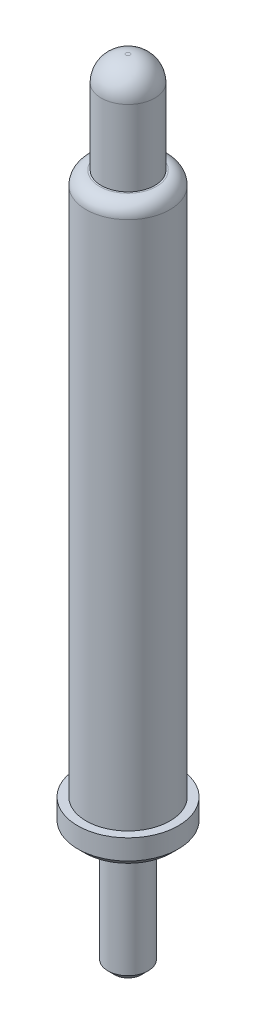
ISO-10303-21;
HEADER;
FILE_DESCRIPTION(('STEP AP214'),'2;1');
FILE_NAME('part.step','',(''),(''),'','','');
FILE_SCHEMA(('AUTOMOTIVE_DESIGN { 1 0 10303 214 1 1 1 1 }'));
ENDSEC;
DATA;
#1=APPLICATION_CONTEXT('core data for automotive mechanical design processes');
#2=APPLICATION_PROTOCOL_DEFINITION('international standard','automotive_design',2000,#1);
#3=PRODUCT_CONTEXT('',#1,'mechanical');
#4=PRODUCT('Part','Part','',(#3));
#5=PRODUCT_RELATED_PRODUCT_CATEGORY('part','',(#4));
#6=PRODUCT_DEFINITION_FORMATION('','',#4);
#7=PRODUCT_DEFINITION_CONTEXT('part definition',#1,'design');
#8=PRODUCT_DEFINITION('design','',#6,#7);
#9=PRODUCT_DEFINITION_SHAPE('','',#8);
#10=(LENGTH_UNIT() NAMED_UNIT(*) SI_UNIT(.MILLI.,.METRE.));
#11=(NAMED_UNIT(*) PLANE_ANGLE_UNIT() SI_UNIT($,.RADIAN.));
#12=(NAMED_UNIT(*) SI_UNIT($,.STERADIAN.) SOLID_ANGLE_UNIT());
#13=UNCERTAINTY_MEASURE_WITH_UNIT(LENGTH_MEASURE(1.E-05),#10,'distance_accuracy_value','');
#14=(GEOMETRIC_REPRESENTATION_CONTEXT(3) GLOBAL_UNCERTAINTY_ASSIGNED_CONTEXT((#13)) GLOBAL_UNIT_ASSIGNED_CONTEXT((#10,
#11,#12)) REPRESENTATION_CONTEXT('',''));
#15=CARTESIAN_POINT('',(0.,0.,0.));
#16=DIRECTION('',(0.,0.,1.));
#17=DIRECTION('',(1.,0.,0.));
#18=AXIS2_PLACEMENT_3D('',#15,#16,#17);
#19=CARTESIAN_POINT('',(0.,0.,0.));
#20=DIRECTION('',(0.,-1.,0.));
#21=DIRECTION('',(0.,0.,-1.));
#22=AXIS2_PLACEMENT_3D('',#19,#20,#21);
#23=CYLINDRICAL_SURFACE('',#22,0.3);
#24=CARTESIAN_POINT('',(0.,1.8,0.));
#25=DIRECTION('',(0.,-1.,0.));
#26=DIRECTION('',(0.,0.,-1.));
#27=AXIS2_PLACEMENT_3D('',#24,#25,#26);
#28=CIRCLE('',#27,0.3);
#29=CARTESIAN_POINT('',(0.,1.8,-0.3));
#30=VERTEX_POINT('',#29);
#31=EDGE_CURVE('E73',#30,#30,#28,.T.);
#32=ORIENTED_EDGE('',*,*,#31,.T.);
#33=EDGE_LOOP('',(#32));
#34=FACE_BOUND('',#33,.T.);
#35=CARTESIAN_POINT('',(0.,0.1,0.));
#36=DIRECTION('',(0.,-1.,0.));
#37=DIRECTION('',(0.,0.,-1.));
#38=AXIS2_PLACEMENT_3D('',#35,#36,#37);
#39=CIRCLE('',#38,0.3);
#40=CARTESIAN_POINT('',(0.,0.1,-0.3));
#41=VERTEX_POINT('',#40);
#42=EDGE_CURVE('E10',#41,#41,#39,.T.);
#43=ORIENTED_EDGE('',*,*,#42,.F.);
#44=EDGE_LOOP('',(#43));
#45=FACE_BOUND('',#44,.T.);
#46=ADVANCED_FACE('F33',(#34,#45),#23,.T.);
#47=CARTESIAN_POINT('',(0.,0.,0.));
#48=DIRECTION('',(0.,1.,0.));
#49=DIRECTION('',(0.,0.,1.));
#50=AXIS2_PLACEMENT_3D('',#47,#48,#49);
#51=CONICAL_SURFACE('',#50,0.2,0.785398163397448);
#52=ORIENTED_EDGE('',*,*,#42,.T.);
#53=EDGE_LOOP('',(#52));
#54=FACE_BOUND('',#53,.T.);
#55=CARTESIAN_POINT('',(0.,0.,0.));
#56=DIRECTION('',(0.,-1.,0.));
#57=DIRECTION('',(0.,0.,-1.));
#58=AXIS2_PLACEMENT_3D('',#55,#56,#57);
#59=CIRCLE('',#58,0.2);
#60=CARTESIAN_POINT('',(0.,0.,-0.2));
#61=VERTEX_POINT('',#60);
#62=EDGE_CURVE('E39',#61,#61,#59,.T.);
#63=ORIENTED_EDGE('',*,*,#62,.F.);
#64=EDGE_LOOP('',(#63));
#65=FACE_BOUND('',#64,.T.);
#66=ADVANCED_FACE('F91',(#54,#65),#51,.T.);
#67=CARTESIAN_POINT('',(0.,0.,0.));
#68=DIRECTION('',(0.,-1.,0.));
#69=DIRECTION('',(0.,0.,-1.));
#70=AXIS2_PLACEMENT_3D('',#67,#68,#69);
#71=PLANE('',#70);
#72=ORIENTED_EDGE('',*,*,#62,.T.);
#73=EDGE_LOOP('',(#72));
#74=FACE_BOUND('',#73,.T.);
#75=ADVANCED_FACE('F95',(#74),#71,.T.);
#76=CARTESIAN_POINT('',(0.,11.8,6.82324567217542E-13));
#77=DIRECTION('',(0.,-1.,0.));
#78=DIRECTION('',(0.,0.,-1.));
#79=AXIS2_PLACEMENT_3D('',#76,#77,#78);
#80=PLANE('',#79);
#81=CARTESIAN_POINT('',(0.,11.8,0.));
#82=DIRECTION('',(0.,-1.,0.));
#83=DIRECTION('',(0.,0.,-1.));
#84=AXIS2_PLACEMENT_3D('',#81,#82,#83);
#85=CIRCLE('',#84,0.0300000000000001);
#86=CARTESIAN_POINT('',(0.,11.8,-0.0300000000000001));
#87=VERTEX_POINT('',#86);
#88=EDGE_CURVE('E43',#87,#87,#85,.T.);
#89=ORIENTED_EDGE('',*,*,#88,.F.);
#90=EDGE_LOOP('',(#89));
#91=FACE_BOUND('',#90,.T.);
#92=ADVANCED_FACE('F99',(#91),#80,.F.);
#93=CARTESIAN_POINT('',(0.,11.43,0.));
#94=DIRECTION('',(0.,-1.,0.));
#95=DIRECTION('',(0.,0.,-1.));
#96=AXIS2_PLACEMENT_3D('',#93,#94,#95);
#97=DEGENERATE_TOROIDAL_SURFACE('',#96,0.03,0.369999999999999,.T.);
#98=CARTESIAN_POINT('',(0.,11.43,0.));
#99=DIRECTION('',(0.,-1.,0.));
#100=DIRECTION('',(0.,0.,-1.));
#101=AXIS2_PLACEMENT_3D('',#98,#99,#100);
#102=CIRCLE('',#101,0.4);
#103=CARTESIAN_POINT('',(0.,11.43,-0.4));
#104=VERTEX_POINT('',#103);
#105=EDGE_CURVE('E47',#104,#104,#102,.T.);
#106=ORIENTED_EDGE('',*,*,#105,.F.);
#107=EDGE_LOOP('',(#106));
#108=FACE_BOUND('',#107,.T.);
#109=ORIENTED_EDGE('',*,*,#88,.T.);
#110=EDGE_LOOP('',(#109));
#111=FACE_BOUND('',#110,.T.);
#112=ADVANCED_FACE('F105',(#108,#111),#97,.T.);
#113=CARTESIAN_POINT('',(0.,0.,0.));
#114=DIRECTION('',(0.,-1.,0.));
#115=DIRECTION('',(0.,0.,-1.));
#116=AXIS2_PLACEMENT_3D('',#113,#114,#115);
#117=CYLINDRICAL_SURFACE('',#116,0.4);
#118=ORIENTED_EDGE('',*,*,#105,.T.);
#119=EDGE_LOOP('',(#118));
#120=FACE_BOUND('',#119,.T.);
#121=CARTESIAN_POINT('',(0.,10.3,0.));
#122=DIRECTION('',(0.,-1.,0.));
#123=DIRECTION('',(0.,0.,-1.));
#124=AXIS2_PLACEMENT_3D('',#121,#122,#123);
#125=CIRCLE('',#124,0.4);
#126=CARTESIAN_POINT('',(0.,10.3,-0.4));
#127=VERTEX_POINT('',#126);
#128=EDGE_CURVE('E52',#127,#127,#125,.T.);
#129=ORIENTED_EDGE('',*,*,#128,.F.);
#130=EDGE_LOOP('',(#129));
#131=FACE_BOUND('',#130,.T.);
#132=ADVANCED_FACE('F109',(#120,#131),#117,.T.);
#133=CARTESIAN_POINT('',(0.,10.3,0.));
#134=DIRECTION('',(0.,-1.,0.));
#135=DIRECTION('',(0.,0.,-1.));
#136=AXIS2_PLACEMENT_3D('',#133,#134,#135);
#137=PLANE('',#136);
#138=CARTESIAN_POINT('',(0.,10.3,0.));
#139=DIRECTION('',(0.,-1.,0.));
#140=DIRECTION('',(0.,0.,-1.));
#141=AXIS2_PLACEMENT_3D('',#138,#139,#140);
#142=CIRCLE('',#141,0.425);
#143=CARTESIAN_POINT('',(0.,10.3,-0.425));
#144=VERTEX_POINT('',#143);
#145=EDGE_CURVE('E55',#144,#144,#142,.T.);
#146=ORIENTED_EDGE('',*,*,#145,.F.);
#147=EDGE_LOOP('',(#146));
#148=FACE_BOUND('',#147,.T.);
#149=ORIENTED_EDGE('',*,*,#128,.T.);
#150=EDGE_LOOP('',(#149));
#151=FACE_BOUND('',#150,.T.);
#152=ADVANCED_FACE('F113',(#148,#151),#137,.F.);
#153=CARTESIAN_POINT('',(0.,10.1,0.));
#154=DIRECTION('',(0.,-1.,0.));
#155=DIRECTION('',(0.,0.,-1.));
#156=AXIS2_PLACEMENT_3D('',#153,#154,#155);
#157=TOROIDAL_SURFACE('',#156,0.425,0.199999999999999);
#158=CARTESIAN_POINT('',(0.,10.1,0.));
#159=DIRECTION('',(0.,-1.,0.));
#160=DIRECTION('',(0.,0.,-1.));
#161=AXIS2_PLACEMENT_3D('',#158,#159,#160);
#162=CIRCLE('',#161,0.625);
#163=CARTESIAN_POINT('',(0.,10.1,-0.625));
#164=VERTEX_POINT('',#163);
#165=EDGE_CURVE('E58',#164,#164,#162,.T.);
#166=ORIENTED_EDGE('',*,*,#165,.F.);
#167=EDGE_LOOP('',(#166));
#168=FACE_BOUND('',#167,.T.);
#169=ORIENTED_EDGE('',*,*,#145,.T.);
#170=EDGE_LOOP('',(#169));
#171=FACE_BOUND('',#170,.T.);
#172=ADVANCED_FACE('F117',(#168,#171),#157,.T.);
#173=CARTESIAN_POINT('',(0.,0.,0.));
#174=DIRECTION('',(0.,-1.,0.));
#175=DIRECTION('',(0.,0.,-1.));
#176=AXIS2_PLACEMENT_3D('',#173,#174,#175);
#177=CYLINDRICAL_SURFACE('',#176,0.625);
#178=ORIENTED_EDGE('',*,*,#165,.T.);
#179=EDGE_LOOP('',(#178));
#180=FACE_BOUND('',#179,.T.);
#181=CARTESIAN_POINT('',(0.,2.2,0.));
#182=DIRECTION('',(0.,-1.,0.));
#183=DIRECTION('',(0.,0.,-1.));
#184=AXIS2_PLACEMENT_3D('',#181,#182,#183);
#185=CIRCLE('',#184,0.625);
#186=CARTESIAN_POINT('',(0.,2.2,-0.625));
#187=VERTEX_POINT('',#186);
#188=EDGE_CURVE('E61',#187,#187,#185,.T.);
#189=ORIENTED_EDGE('',*,*,#188,.F.);
#190=EDGE_LOOP('',(#189));
#191=FACE_BOUND('',#190,.T.);
#192=ADVANCED_FACE('F121',(#180,#191),#177,.T.);
#193=CARTESIAN_POINT('',(0.,2.2,0.));
#194=DIRECTION('',(0.,-1.,0.));
#195=DIRECTION('',(0.,0.,-1.));
#196=AXIS2_PLACEMENT_3D('',#193,#194,#195);
#197=PLANE('',#196);
#198=CARTESIAN_POINT('',(0.,2.2,0.));
#199=DIRECTION('',(0.,-1.,0.));
#200=DIRECTION('',(0.,0.,-1.));
#201=AXIS2_PLACEMENT_3D('',#198,#199,#200);
#202=CIRCLE('',#201,0.75);
#203=CARTESIAN_POINT('',(0.,2.2,-0.75));
#204=VERTEX_POINT('',#203);
#205=EDGE_CURVE('E64',#204,#204,#202,.T.);
#206=ORIENTED_EDGE('',*,*,#205,.F.);
#207=EDGE_LOOP('',(#206));
#208=FACE_BOUND('',#207,.T.);
#209=ORIENTED_EDGE('',*,*,#188,.T.);
#210=EDGE_LOOP('',(#209));
#211=FACE_BOUND('',#210,.T.);
#212=ADVANCED_FACE('F125',(#208,#211),#197,.F.);
#213=CARTESIAN_POINT('',(0.,0.,0.));
#214=DIRECTION('',(0.,-1.,0.));
#215=DIRECTION('',(0.,0.,-1.));
#216=AXIS2_PLACEMENT_3D('',#213,#214,#215);
#217=CYLINDRICAL_SURFACE('',#216,0.75);
#218=ORIENTED_EDGE('',*,*,#205,.T.);
#219=EDGE_LOOP('',(#218));
#220=FACE_BOUND('',#219,.T.);
#221=CARTESIAN_POINT('',(0.,1.9,0.));
#222=DIRECTION('',(0.,-1.,0.));
#223=DIRECTION('',(0.,0.,-1.));
#224=AXIS2_PLACEMENT_3D('',#221,#222,#223);
#225=CIRCLE('',#224,0.75);
#226=CARTESIAN_POINT('',(0.,1.9,-0.75));
#227=VERTEX_POINT('',#226);
#228=EDGE_CURVE('E67',#227,#227,#225,.T.);
#229=ORIENTED_EDGE('',*,*,#228,.F.);
#230=EDGE_LOOP('',(#229));
#231=FACE_BOUND('',#230,.T.);
#232=ADVANCED_FACE('F87',(#220,#231),#217,.T.);
#233=CARTESIAN_POINT('',(0.,1.8,0.));
#234=DIRECTION('',(0.,1.,0.));
#235=DIRECTION('',(0.,0.,1.));
#236=AXIS2_PLACEMENT_3D('',#233,#234,#235);
#237=CONICAL_SURFACE('',#236,0.65,0.785398163397448);
#238=ORIENTED_EDGE('',*,*,#228,.T.);
#239=EDGE_LOOP('',(#238));
#240=FACE_BOUND('',#239,.T.);
#241=CARTESIAN_POINT('',(0.,1.8,0.));
#242=DIRECTION('',(0.,-1.,0.));
#243=DIRECTION('',(0.,0.,-1.));
#244=AXIS2_PLACEMENT_3D('',#241,#242,#243);
#245=CIRCLE('',#244,0.65);
#246=CARTESIAN_POINT('',(0.,1.8,-0.65));
#247=VERTEX_POINT('',#246);
#248=EDGE_CURVE('E70',#247,#247,#245,.T.);
#249=ORIENTED_EDGE('',*,*,#248,.F.);
#250=EDGE_LOOP('',(#249));
#251=FACE_BOUND('',#250,.T.);
#252=ADVANCED_FACE('F81',(#240,#251),#237,.T.);
#253=CARTESIAN_POINT('',(0.,1.8,0.));
#254=DIRECTION('',(0.,-1.,0.));
#255=DIRECTION('',(0.,0.,-1.));
#256=AXIS2_PLACEMENT_3D('',#253,#254,#255);
#257=PLANE('',#256);
#258=ORIENTED_EDGE('',*,*,#248,.T.);
#259=EDGE_LOOP('',(#258));
#260=FACE_BOUND('',#259,.T.);
#261=ORIENTED_EDGE('',*,*,#31,.F.);
#262=EDGE_LOOP('',(#261));
#263=FACE_BOUND('',#262,.T.);
#264=ADVANCED_FACE('F79',(#260,#263),#257,.T.);
#265=CLOSED_SHELL('',(#46,#66,#75,#92,#112,#132,#152,#172,#192,#212,#232,#252,#264));
#266=MANIFOLD_SOLID_BREP('B2',#265);
#267=ADVANCED_BREP_SHAPE_REPRESENTATION('',(#18,#266),#14);
#268=SHAPE_DEFINITION_REPRESENTATION(#9,#267);
ENDSEC;
END-ISO-10303-21;
